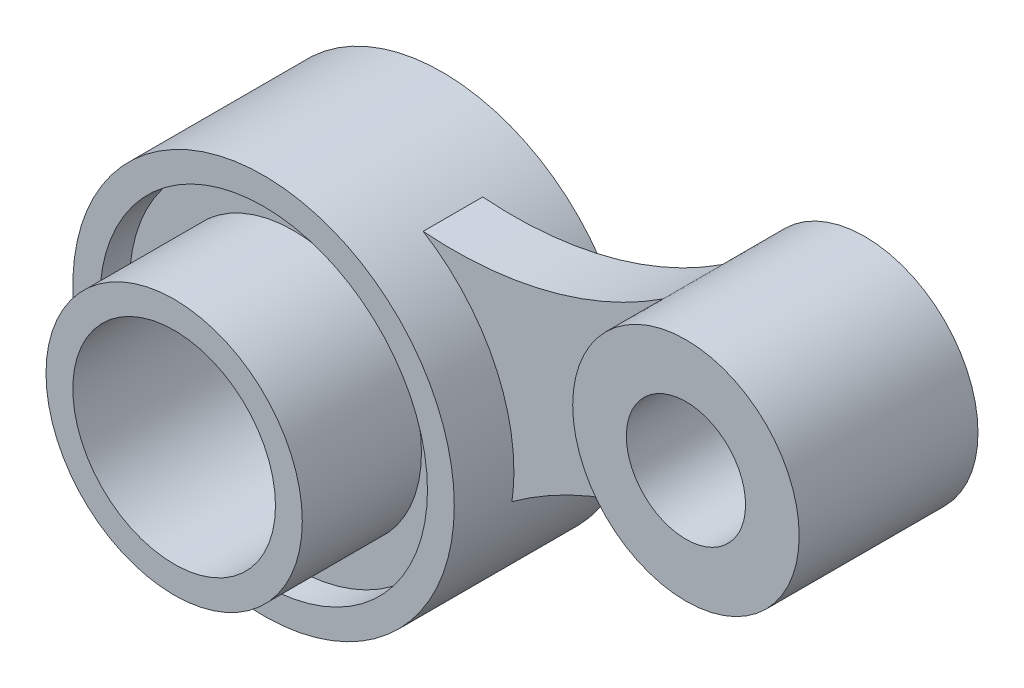
ISO-10303-21;
HEADER;
FILE_DESCRIPTION(('STEP AP214'),'2;1');
FILE_NAME('part.step','',(''),(''),'','','');
FILE_SCHEMA(('AUTOMOTIVE_DESIGN { 1 0 10303 214 1 1 1 1 }'));
ENDSEC;
DATA;
#1=APPLICATION_CONTEXT('core data for automotive mechanical design processes');
#2=APPLICATION_PROTOCOL_DEFINITION('international standard','automotive_design',2000,#1);
#3=PRODUCT_CONTEXT('',#1,'mechanical');
#4=PRODUCT('Part','Part','',(#3));
#5=PRODUCT_RELATED_PRODUCT_CATEGORY('part','',(#4));
#6=PRODUCT_DEFINITION_FORMATION('','',#4);
#7=PRODUCT_DEFINITION_CONTEXT('part definition',#1,'design');
#8=PRODUCT_DEFINITION('design','',#6,#7);
#9=PRODUCT_DEFINITION_SHAPE('','',#8);
#10=(LENGTH_UNIT() NAMED_UNIT(*) SI_UNIT(.MILLI.,.METRE.));
#11=(NAMED_UNIT(*) PLANE_ANGLE_UNIT() SI_UNIT($,.RADIAN.));
#12=(NAMED_UNIT(*) SI_UNIT($,.STERADIAN.) SOLID_ANGLE_UNIT());
#13=UNCERTAINTY_MEASURE_WITH_UNIT(LENGTH_MEASURE(1.E-05),#10,'distance_accuracy_value','');
#14=(GEOMETRIC_REPRESENTATION_CONTEXT(3) GLOBAL_UNCERTAINTY_ASSIGNED_CONTEXT((#13)) GLOBAL_UNIT_ASSIGNED_CONTEXT((#10,
#11,#12)) REPRESENTATION_CONTEXT('',''));
#15=CARTESIAN_POINT('',(0.,0.,0.));
#16=DIRECTION('',(0.,0.,1.));
#17=DIRECTION('',(1.,0.,0.));
#18=AXIS2_PLACEMENT_3D('',#15,#16,#17);
#19=CARTESIAN_POINT('',(-34.3390125408945,-15.6194811034722,15.));
#20=DIRECTION('',(0.,0.,1.));
#21=DIRECTION('',(1.,0.,0.));
#22=AXIS2_PLACEMENT_3D('',#19,#20,#21);
#23=PLANE('',#22);
#24=CARTESIAN_POINT('',(-34.3390125408945,-15.6194811034722,15.));
#25=DIRECTION('',(0.,0.,1.));
#26=DIRECTION('',(1.,0.,0.));
#27=AXIS2_PLACEMENT_3D('',#24,#25,#26);
#28=CIRCLE('',#27,32.);
#29=CARTESIAN_POINT('',(-2.33901254089448,-15.6194811034722,15.));
#30=VERTEX_POINT('',#29);
#31=EDGE_CURVE('E12',#30,#30,#28,.T.);
#32=ORIENTED_EDGE('',*,*,#31,.T.);
#33=EDGE_LOOP('',(#32));
#34=FACE_BOUND('',#33,.T.);
#35=CARTESIAN_POINT('',(-34.3390125408945,-15.6194811034722,15.));
#36=DIRECTION('',(0.,0.,1.));
#37=DIRECTION('',(1.,0.,0.));
#38=AXIS2_PLACEMENT_3D('',#35,#36,#37);
#39=CIRCLE('',#38,27.5);
#40=CARTESIAN_POINT('',(-6.83901254089448,-15.6194811034722,15.));
#41=VERTEX_POINT('',#40);
#42=EDGE_CURVE('E67',#41,#41,#39,.F.);
#43=ORIENTED_EDGE('',*,*,#42,.T.);
#44=EDGE_LOOP('',(#43));
#45=FACE_BOUND('',#44,.T.);
#46=ADVANCED_FACE('F63',(#34,#45),#23,.T.);
#47=CARTESIAN_POINT('',(-34.3390125408945,-15.6194811034722,15.));
#48=DIRECTION('',(0.,0.,-1.));
#49=DIRECTION('',(-1.,0.,0.));
#50=AXIS2_PLACEMENT_3D('',#47,#48,#49);
#51=CYLINDRICAL_SURFACE('',#50,32.);
#52=DIRECTION('',(0.,0.,-1.));
#53=VECTOR('',#52,1.);
#54=CARTESIAN_POINT('',(-2.66752346272685,-20.1929676915698,5.));
#55=LINE('',#54,#53);
#56=CARTESIAN_POINT('',(-2.66752346272685,-20.1929676915698,5.));
#57=VERTEX_POINT('',#56);
#58=CARTESIAN_POINT('',(-2.66752346272685,-20.1929676915698,-5.));
#59=VERTEX_POINT('',#58);
#60=EDGE_CURVE('E80',#57,#59,#55,.T.);
#61=ORIENTED_EDGE('',*,*,#60,.F.);
#62=CARTESIAN_POINT('',(-34.3390125408945,-15.6194811034722,5.));
#63=DIRECTION('',(0.,0.,1.));
#64=DIRECTION('',(1.,0.,0.));
#65=AXIS2_PLACEMENT_3D('',#62,#63,#64);
#66=CIRCLE('',#65,32.);
#67=CARTESIAN_POINT('',(-17.5608569807066,11.6292527386376,5.));
#68=VERTEX_POINT('',#67);
#69=EDGE_CURVE('E85',#57,#68,#66,.T.);
#70=ORIENTED_EDGE('',*,*,#69,.T.);
#71=DIRECTION('',(0.,0.,-1.));
#72=VECTOR('',#71,1.);
#73=CARTESIAN_POINT('',(-17.5608569807066,11.6292527386376,5.));
#74=LINE('',#73,#72);
#75=CARTESIAN_POINT('',(-17.5608569807066,11.6292527386376,-5.));
#76=VERTEX_POINT('',#75);
#77=EDGE_CURVE('E125',#68,#76,#74,.T.);
#78=ORIENTED_EDGE('',*,*,#77,.T.);
#79=CARTESIAN_POINT('',(-34.3390125408945,-15.6194811034722,-5.));
#80=DIRECTION('',(0.,0.,1.));
#81=DIRECTION('',(1.,0.,0.));
#82=AXIS2_PLACEMENT_3D('',#79,#80,#81);
#83=CIRCLE('',#82,32.);
#84=EDGE_CURVE('E129',#59,#76,#83,.T.);
#85=ORIENTED_EDGE('',*,*,#84,.F.);
#86=EDGE_LOOP('',(#61,#70,#78,#85));
#87=FACE_BOUND('',#86,.T.);
#88=ORIENTED_EDGE('',*,*,#31,.F.);
#89=EDGE_LOOP('',(#88));
#90=FACE_BOUND('',#89,.T.);
#91=CARTESIAN_POINT('',(-34.3390125408945,-15.6194811034722,-15.));
#92=DIRECTION('',(0.,0.,1.));
#93=DIRECTION('',(1.,0.,0.));
#94=AXIS2_PLACEMENT_3D('',#91,#92,#93);
#95=CIRCLE('',#94,32.);
#96=CARTESIAN_POINT('',(-2.33901254089448,-15.6194811034722,-15.));
#97=VERTEX_POINT('',#96);
#98=EDGE_CURVE('E72',#97,#97,#95,.T.);
#99=ORIENTED_EDGE('',*,*,#98,.T.);
#100=EDGE_LOOP('',(#99));
#101=FACE_BOUND('',#100,.T.);
#102=ADVANCED_FACE('F65',(#87,#90,#101),#51,.T.);
#103=CARTESIAN_POINT('',(-34.3390125408945,-15.6194811034722,-15.));
#104=DIRECTION('',(0.,0.,1.));
#105=DIRECTION('',(1.,0.,0.));
#106=AXIS2_PLACEMENT_3D('',#103,#104,#105);
#107=PLANE('',#106);
#108=CARTESIAN_POINT('',(-34.3390125408945,-15.6194811034722,-15.));
#109=DIRECTION('',(0.,0.,1.));
#110=DIRECTION('',(1.,0.,0.));
#111=AXIS2_PLACEMENT_3D('',#108,#109,#110);
#112=CIRCLE('',#111,17.);
#113=CARTESIAN_POINT('',(-17.3390125408945,-15.6194811034722,-15.));
#114=VERTEX_POINT('',#113);
#115=EDGE_CURVE('E221',#114,#114,#112,.T.);
#116=ORIENTED_EDGE('',*,*,#115,.T.);
#117=EDGE_LOOP('',(#116));
#118=FACE_BOUND('',#117,.T.);
#119=ORIENTED_EDGE('',*,*,#98,.F.);
#120=EDGE_LOOP('',(#119));
#121=FACE_BOUND('',#120,.T.);
#122=ADVANCED_FACE('F141',(#118,#121),#107,.F.);
#123=CARTESIAN_POINT('',(34.9503656954834,-71.9703219623377,5.));
#124=DIRECTION('',(0.,0.,-1.));
#125=DIRECTION('',(-1.,0.,0.));
#126=AXIS2_PLACEMENT_3D('',#123,#124,#125);
#127=CYLINDRICAL_SURFACE('',#126,64.);
#128=CARTESIAN_POINT('',(34.9503656954834,-71.9703219623377,-5.));
#129=DIRECTION('',(0.,0.,1.));
#130=DIRECTION('',(1.,0.,0.));
#131=AXIS2_PLACEMENT_3D('',#128,#129,#130);
#132=CIRCLE('',#131,64.);
#133=CARTESIAN_POINT('',(28.5171824490681,-8.29446976295178,-5.));
#134=VERTEX_POINT('',#133);
#135=EDGE_CURVE('E117',#59,#134,#132,.F.);
#136=ORIENTED_EDGE('',*,*,#135,.T.);
#137=DIRECTION('',(0.,0.,-1.));
#138=VECTOR('',#137,1.);
#139=CARTESIAN_POINT('',(28.5171824490681,-8.29446976295178,5.));
#140=LINE('',#139,#138);
#141=CARTESIAN_POINT('',(28.5171824490681,-8.29446976295177,5.));
#142=VERTEX_POINT('',#141);
#143=EDGE_CURVE('E111',#142,#134,#140,.T.);
#144=ORIENTED_EDGE('',*,*,#143,.F.);
#145=CARTESIAN_POINT('',(34.9503656954834,-71.9703219623377,5.));
#146=DIRECTION('',(0.,0.,1.));
#147=DIRECTION('',(1.,0.,0.));
#148=AXIS2_PLACEMENT_3D('',#145,#146,#147);
#149=CIRCLE('',#148,64.);
#150=EDGE_CURVE('E131',#57,#142,#149,.F.);
#151=ORIENTED_EDGE('',*,*,#150,.F.);
#152=ORIENTED_EDGE('',*,*,#60,.T.);
#153=EDGE_LOOP('',(#136,#144,#151,#152));
#154=FACE_BOUND('',#153,.T.);
#155=ADVANCED_FACE('F143',(#154),#127,.F.);
#156=CARTESIAN_POINT('',(-12.4526797147926,75.4250717632413,5.));
#157=DIRECTION('',(0.,0.,-1.));
#158=DIRECTION('',(-1.,0.,0.));
#159=AXIS2_PLACEMENT_3D('',#156,#157,#158);
#160=CYLINDRICAL_SURFACE('',#159,64.);
#161=CARTESIAN_POINT('',(-12.4526797147926,75.4250717632413,-5.));
#162=DIRECTION('',(0.,0.,1.));
#163=DIRECTION('',(1.,0.,0.));
#164=AXIS2_PLACEMENT_3D('',#161,#162,#163);
#165=CIRCLE('',#164,64.);
#166=CARTESIAN_POINT('',(22.6481171401393,21.9093351977338,-5.));
#167=VERTEX_POINT('',#166);
#168=EDGE_CURVE('E116',#76,#167,#165,.T.);
#169=ORIENTED_EDGE('',*,*,#168,.F.);
#170=ORIENTED_EDGE('',*,*,#77,.F.);
#171=CARTESIAN_POINT('',(-12.4526797147926,75.4250717632413,5.));
#172=DIRECTION('',(0.,0.,1.));
#173=DIRECTION('',(1.,0.,0.));
#174=AXIS2_PLACEMENT_3D('',#171,#172,#173);
#175=CIRCLE('',#174,64.);
#176=CARTESIAN_POINT('',(22.6481171401393,21.9093351977338,5.));
#177=VERTEX_POINT('',#176);
#178=EDGE_CURVE('E124',#68,#177,#175,.T.);
#179=ORIENTED_EDGE('',*,*,#178,.T.);
#180=DIRECTION('',(0.,0.,-1.));
#181=VECTOR('',#180,1.);
#182=CARTESIAN_POINT('',(22.6481171401392,21.9093351977337,5.));
#183=LINE('',#182,#181);
#184=EDGE_CURVE('E108',#177,#167,#183,.T.);
#185=ORIENTED_EDGE('',*,*,#184,.T.);
#186=EDGE_LOOP('',(#169,#170,#179,#185));
#187=FACE_BOUND('',#186,.T.);
#188=ADVANCED_FACE('F122',(#187),#160,.F.);
#189=CARTESIAN_POINT('',(0.,0.,5.));
#190=DIRECTION('',(0.,0.,1.));
#191=DIRECTION('',(1.,0.,0.));
#192=AXIS2_PLACEMENT_3D('',#189,#190,#191);
#193=PLANE('',#192);
#194=ORIENTED_EDGE('',*,*,#69,.F.);
#195=ORIENTED_EDGE('',*,*,#150,.T.);
#196=CARTESIAN_POINT('',(36.5278624718898,8.93425641085357,5.));
#197=DIRECTION('',(0.,0.,1.));
#198=DIRECTION('',(1.,0.,0.));
#199=AXIS2_PLACEMENT_3D('',#196,#197,#198);
#200=CIRCLE('',#199,19.);
#201=EDGE_CURVE('E236',#177,#142,#200,.T.);
#202=ORIENTED_EDGE('',*,*,#201,.F.);
#203=ORIENTED_EDGE('',*,*,#178,.F.);
#204=EDGE_LOOP('',(#194,#195,#202,#203));
#205=FACE_BOUND('',#204,.T.);
#206=ADVANCED_FACE('F161',(#205),#193,.T.);
#207=CARTESIAN_POINT('',(0.,0.,-5.));
#208=DIRECTION('',(0.,0.,1.));
#209=DIRECTION('',(1.,0.,0.));
#210=AXIS2_PLACEMENT_3D('',#207,#208,#209);
#211=PLANE('',#210);
#212=ORIENTED_EDGE('',*,*,#84,.T.);
#213=ORIENTED_EDGE('',*,*,#168,.T.);
#214=CARTESIAN_POINT('',(36.5278624718898,8.93425641085357,-5.));
#215=DIRECTION('',(0.,0.,1.));
#216=DIRECTION('',(1.,0.,0.));
#217=AXIS2_PLACEMENT_3D('',#214,#215,#216);
#218=CIRCLE('',#217,19.);
#219=EDGE_CURVE('E104',#167,#134,#218,.T.);
#220=ORIENTED_EDGE('',*,*,#219,.T.);
#221=ORIENTED_EDGE('',*,*,#135,.F.);
#222=EDGE_LOOP('',(#212,#213,#220,#221));
#223=FACE_BOUND('',#222,.T.);
#224=ADVANCED_FACE('F128',(#223),#211,.F.);
#225=CARTESIAN_POINT('',(36.5278624718898,8.93425641085357,15.));
#226=DIRECTION('',(0.,0.,-1.));
#227=DIRECTION('',(-1.,0.,0.));
#228=AXIS2_PLACEMENT_3D('',#225,#226,#227);
#229=CYLINDRICAL_SURFACE('',#228,19.);
#230=ORIENTED_EDGE('',*,*,#201,.T.);
#231=ORIENTED_EDGE('',*,*,#143,.T.);
#232=ORIENTED_EDGE('',*,*,#219,.F.);
#233=ORIENTED_EDGE('',*,*,#184,.F.);
#234=EDGE_LOOP('',(#230,#231,#232,#233));
#235=FACE_BOUND('',#234,.T.);
#236=CARTESIAN_POINT('',(36.5278624718898,8.93425641085357,15.));
#237=DIRECTION('',(0.,0.,1.));
#238=DIRECTION('',(1.,0.,0.));
#239=AXIS2_PLACEMENT_3D('',#236,#237,#238);
#240=CIRCLE('',#239,19.);
#241=CARTESIAN_POINT('',(55.5278624718898,8.93425641085357,15.));
#242=VERTEX_POINT('',#241);
#243=EDGE_CURVE('E223',#242,#242,#240,.T.);
#244=ORIENTED_EDGE('',*,*,#243,.F.);
#245=EDGE_LOOP('',(#244));
#246=FACE_BOUND('',#245,.T.);
#247=CARTESIAN_POINT('',(36.5278624718898,8.93425641085357,-15.));
#248=DIRECTION('',(0.,0.,1.));
#249=DIRECTION('',(1.,0.,0.));
#250=AXIS2_PLACEMENT_3D('',#247,#248,#249);
#251=CIRCLE('',#250,19.);
#252=CARTESIAN_POINT('',(55.5278624718898,8.93425641085357,-15.));
#253=VERTEX_POINT('',#252);
#254=EDGE_CURVE('E229',#253,#253,#251,.T.);
#255=ORIENTED_EDGE('',*,*,#254,.T.);
#256=EDGE_LOOP('',(#255));
#257=FACE_BOUND('',#256,.T.);
#258=ADVANCED_FACE('F106',(#235,#246,#257),#229,.T.);
#259=CARTESIAN_POINT('',(36.5278624718898,8.93425641085357,15.));
#260=DIRECTION('',(0.,0.,1.));
#261=DIRECTION('',(1.,0.,0.));
#262=AXIS2_PLACEMENT_3D('',#259,#260,#261);
#263=PLANE('',#262);
#264=CARTESIAN_POINT('',(36.5278624718898,8.93425641085357,15.));
#265=DIRECTION('',(0.,0.,1.));
#266=DIRECTION('',(1.,0.,0.));
#267=AXIS2_PLACEMENT_3D('',#264,#265,#266);
#268=CIRCLE('',#267,10.);
#269=CARTESIAN_POINT('',(46.5278624718898,8.93425641085357,15.));
#270=VERTEX_POINT('',#269);
#271=EDGE_CURVE('E224',#270,#270,#268,.T.);
#272=ORIENTED_EDGE('',*,*,#271,.F.);
#273=EDGE_LOOP('',(#272));
#274=FACE_BOUND('',#273,.T.);
#275=ORIENTED_EDGE('',*,*,#243,.T.);
#276=EDGE_LOOP('',(#275));
#277=FACE_BOUND('',#276,.T.);
#278=ADVANCED_FACE('F167',(#274,#277),#263,.T.);
#279=CARTESIAN_POINT('',(36.5278624718898,8.93425641085357,-15.));
#280=DIRECTION('',(0.,0.,1.));
#281=DIRECTION('',(1.,0.,0.));
#282=AXIS2_PLACEMENT_3D('',#279,#280,#281);
#283=PLANE('',#282);
#284=CARTESIAN_POINT('',(36.5278624718898,8.93425641085357,-15.));
#285=DIRECTION('',(0.,0.,1.));
#286=DIRECTION('',(1.,0.,0.));
#287=AXIS2_PLACEMENT_3D('',#284,#285,#286);
#288=CIRCLE('',#287,10.);
#289=CARTESIAN_POINT('',(46.5278624718898,8.93425641085357,-15.));
#290=VERTEX_POINT('',#289);
#291=EDGE_CURVE('E220',#290,#290,#288,.T.);
#292=ORIENTED_EDGE('',*,*,#291,.T.);
#293=EDGE_LOOP('',(#292));
#294=FACE_BOUND('',#293,.T.);
#295=ORIENTED_EDGE('',*,*,#254,.F.);
#296=EDGE_LOOP('',(#295));
#297=FACE_BOUND('',#296,.T.);
#298=ADVANCED_FACE('F170',(#294,#297),#283,.F.);
#299=CARTESIAN_POINT('',(36.5278624718898,8.93425641085357,-15.));
#300=DIRECTION('',(0.,0.,1.));
#301=DIRECTION('',(1.,0.,0.));
#302=AXIS2_PLACEMENT_3D('',#299,#300,#301);
#303=CYLINDRICAL_SURFACE('',#302,10.);
#304=ORIENTED_EDGE('',*,*,#291,.F.);
#305=EDGE_LOOP('',(#304));
#306=FACE_BOUND('',#305,.T.);
#307=ORIENTED_EDGE('',*,*,#271,.T.);
#308=EDGE_LOOP('',(#307));
#309=FACE_BOUND('',#308,.T.);
#310=ADVANCED_FACE('F174',(#306,#309),#303,.F.);
#311=CARTESIAN_POINT('',(-34.3390125408945,-15.6194811034722,-15.));
#312=DIRECTION('',(0.,0.,1.));
#313=DIRECTION('',(1.,0.,0.));
#314=AXIS2_PLACEMENT_3D('',#311,#312,#313);
#315=CYLINDRICAL_SURFACE('',#314,17.);
#316=ORIENTED_EDGE('',*,*,#115,.F.);
#317=EDGE_LOOP('',(#316));
#318=FACE_BOUND('',#317,.T.);
#319=CARTESIAN_POINT('',(-34.3390125408945,-15.6194811034722,30.));
#320=DIRECTION('',(0.,0.,1.));
#321=DIRECTION('',(1.,0.,0.));
#322=AXIS2_PLACEMENT_3D('',#319,#320,#321);
#323=CIRCLE('',#322,17.);
#324=CARTESIAN_POINT('',(-17.3390125408945,-15.6194811034722,30.));
#325=VERTEX_POINT('',#324);
#326=EDGE_CURVE('E212',#325,#325,#323,.T.);
#327=ORIENTED_EDGE('',*,*,#326,.T.);
#328=EDGE_LOOP('',(#327));
#329=FACE_BOUND('',#328,.T.);
#330=ADVANCED_FACE('F180',(#318,#329),#315,.F.);
#331=CARTESIAN_POINT('',(-34.3390125408945,-15.6194811034722,30.));
#332=DIRECTION('',(0.,0.,1.));
#333=DIRECTION('',(1.,0.,0.));
#334=AXIS2_PLACEMENT_3D('',#331,#332,#333);
#335=PLANE('',#334);
#336=CARTESIAN_POINT('',(-34.3390125408945,-15.6194811034722,30.));
#337=DIRECTION('',(0.,0.,1.));
#338=DIRECTION('',(1.,0.,0.));
#339=AXIS2_PLACEMENT_3D('',#336,#337,#338);
#340=CIRCLE('',#339,21.5);
#341=CARTESIAN_POINT('',(-12.8390125408945,-15.6194811034722,30.));
#342=VERTEX_POINT('',#341);
#343=EDGE_CURVE('E217',#342,#342,#340,.T.);
#344=ORIENTED_EDGE('',*,*,#343,.T.);
#345=EDGE_LOOP('',(#344));
#346=FACE_BOUND('',#345,.T.);
#347=ORIENTED_EDGE('',*,*,#326,.F.);
#348=EDGE_LOOP('',(#347));
#349=FACE_BOUND('',#348,.T.);
#350=ADVANCED_FACE('F184',(#346,#349),#335,.T.);
#351=CARTESIAN_POINT('',(-34.3390125408945,-15.6194811034722,30.));
#352=DIRECTION('',(0.,0.,-1.));
#353=DIRECTION('',(-1.,0.,0.));
#354=AXIS2_PLACEMENT_3D('',#351,#352,#353);
#355=CYLINDRICAL_SURFACE('',#354,21.5);
#356=ORIENTED_EDGE('',*,*,#343,.F.);
#357=EDGE_LOOP('',(#356));
#358=FACE_BOUND('',#357,.T.);
#359=CARTESIAN_POINT('',(-34.3390125408945,-15.6194811034722,10.));
#360=DIRECTION('',(0.,0.,1.));
#361=DIRECTION('',(1.,0.,0.));
#362=AXIS2_PLACEMENT_3D('',#359,#360,#361);
#363=CIRCLE('',#362,21.5);
#364=CARTESIAN_POINT('',(-12.8390125408945,-15.6194811034722,10.));
#365=VERTEX_POINT('',#364);
#366=EDGE_CURVE('E205',#365,#365,#363,.T.);
#367=ORIENTED_EDGE('',*,*,#366,.T.);
#368=EDGE_LOOP('',(#367));
#369=FACE_BOUND('',#368,.T.);
#370=ADVANCED_FACE('F186',(#358,#369),#355,.T.);
#371=CARTESIAN_POINT('',(-34.3390125408945,-15.6194811034722,30.));
#372=DIRECTION('',(0.,0.,-1.));
#373=DIRECTION('',(-1.,0.,0.));
#374=AXIS2_PLACEMENT_3D('',#371,#372,#373);
#375=CYLINDRICAL_SURFACE('',#374,27.5);
#376=ORIENTED_EDGE('',*,*,#42,.F.);
#377=EDGE_LOOP('',(#376));
#378=FACE_BOUND('',#377,.T.);
#379=CARTESIAN_POINT('',(-34.3390125408945,-15.6194811034722,10.));
#380=DIRECTION('',(0.,0.,1.));
#381=DIRECTION('',(1.,0.,0.));
#382=AXIS2_PLACEMENT_3D('',#379,#380,#381);
#383=CIRCLE('',#382,27.5);
#384=CARTESIAN_POINT('',(-6.83901254089448,-15.6194811034722,10.));
#385=VERTEX_POINT('',#384);
#386=EDGE_CURVE('E208',#385,#385,#383,.T.);
#387=ORIENTED_EDGE('',*,*,#386,.F.);
#388=EDGE_LOOP('',(#387));
#389=FACE_BOUND('',#388,.T.);
#390=ADVANCED_FACE('F189',(#378,#389),#375,.F.);
#391=CARTESIAN_POINT('',(-34.3390125408945,-15.6194811034722,10.));
#392=DIRECTION('',(0.,0.,1.));
#393=DIRECTION('',(1.,0.,0.));
#394=AXIS2_PLACEMENT_3D('',#391,#392,#393);
#395=PLANE('',#394);
#396=ORIENTED_EDGE('',*,*,#366,.F.);
#397=EDGE_LOOP('',(#396));
#398=FACE_BOUND('',#397,.T.);
#399=ORIENTED_EDGE('',*,*,#386,.T.);
#400=EDGE_LOOP('',(#399));
#401=FACE_BOUND('',#400,.T.);
#402=ADVANCED_FACE('F196',(#398,#401),#395,.T.);
#403=CLOSED_SHELL('',(#46,#102,#122,#155,#188,#206,#224,#258,#278,#298,#310,#330,#350,#370,#390,#402));
#404=MANIFOLD_SOLID_BREP('B2',#403);
#405=ADVANCED_BREP_SHAPE_REPRESENTATION('',(#18,#404),#14);
#406=SHAPE_DEFINITION_REPRESENTATION(#9,#405);
ENDSEC;
END-ISO-10303-21;
